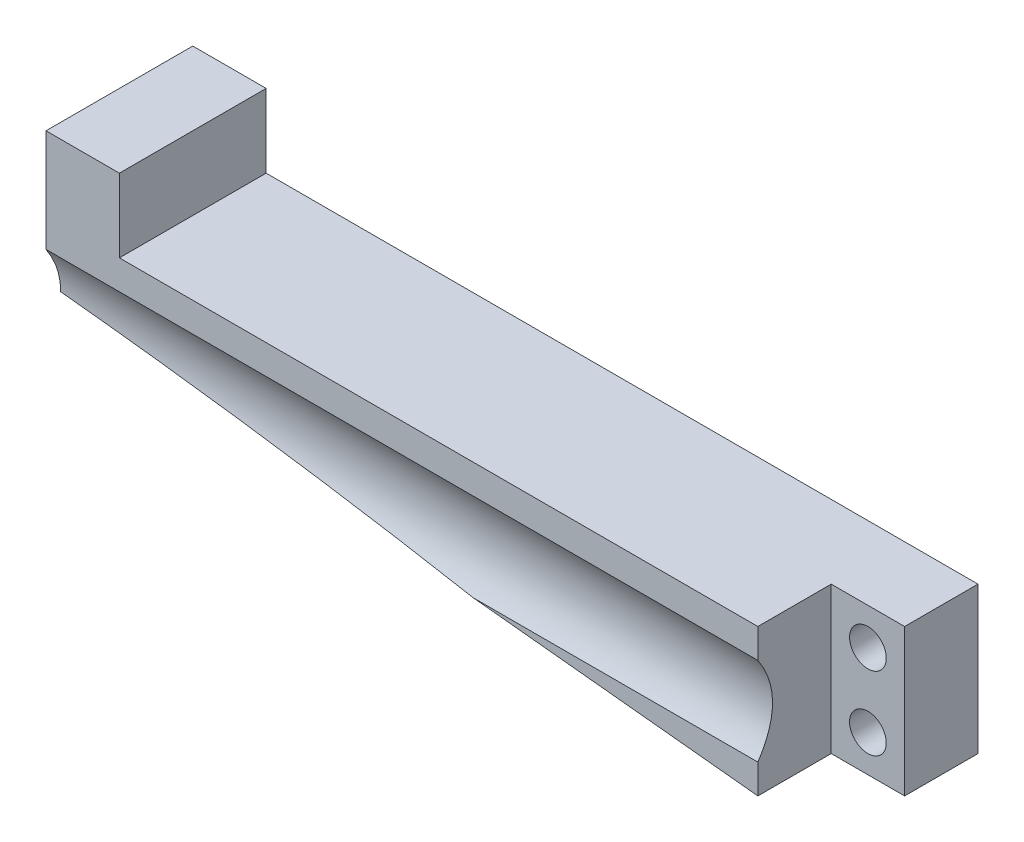
ISO-10303-21;
HEADER;
FILE_DESCRIPTION(('STEP AP214'),'2;1');
FILE_NAME('part.step','',(''),(''),'','','');
FILE_SCHEMA(('AUTOMOTIVE_DESIGN { 1 0 10303 214 1 1 1 1 }'));
ENDSEC;
DATA;
#1=APPLICATION_CONTEXT('core data for automotive mechanical design processes');
#2=APPLICATION_PROTOCOL_DEFINITION('international standard','automotive_design',2000,#1);
#3=PRODUCT_CONTEXT('',#1,'mechanical');
#4=PRODUCT('Part','Part','',(#3));
#5=PRODUCT_RELATED_PRODUCT_CATEGORY('part','',(#4));
#6=PRODUCT_DEFINITION_FORMATION('','',#4);
#7=PRODUCT_DEFINITION_CONTEXT('part definition',#1,'design');
#8=PRODUCT_DEFINITION('design','',#6,#7);
#9=PRODUCT_DEFINITION_SHAPE('','',#8);
#10=(LENGTH_UNIT() NAMED_UNIT(*) SI_UNIT(.MILLI.,.METRE.));
#11=(NAMED_UNIT(*) PLANE_ANGLE_UNIT() SI_UNIT($,.RADIAN.));
#12=(NAMED_UNIT(*) SI_UNIT($,.STERADIAN.) SOLID_ANGLE_UNIT());
#13=UNCERTAINTY_MEASURE_WITH_UNIT(LENGTH_MEASURE(1.E-05),#10,'distance_accuracy_value','');
#14=(GEOMETRIC_REPRESENTATION_CONTEXT(3) GLOBAL_UNCERTAINTY_ASSIGNED_CONTEXT((#13)) GLOBAL_UNIT_ASSIGNED_CONTEXT((#10,
#11,#12)) REPRESENTATION_CONTEXT('',''));
#15=CARTESIAN_POINT('',(0.,0.,0.));
#16=DIRECTION('',(0.,0.,1.));
#17=DIRECTION('',(1.,0.,0.));
#18=AXIS2_PLACEMENT_3D('',#15,#16,#17);
#19=CARTESIAN_POINT('',(0.,0.,20.));
#20=DIRECTION('',(0.,0.,-1.));
#21=DIRECTION('',(-1.,0.,0.));
#22=AXIS2_PLACEMENT_3D('',#19,#20,#21);
#23=PLANE('',#22);
#24=DIRECTION('',(0.,-1.,0.));
#25=VECTOR('',#24,1.);
#26=CARTESIAN_POINT('',(-102.,9.99999999999999,20.));
#27=LINE('',#26,#25);
#28=CARTESIAN_POINT('',(-102.,20.,20.));
#29=VERTEX_POINT('',#28);
#30=CARTESIAN_POINT('',(-102.,5.99999999999998,20.));
#31=VERTEX_POINT('',#30);
#32=EDGE_CURVE('E127',#29,#31,#27,.T.);
#33=ORIENTED_EDGE('',*,*,#32,.T.);
#34=DIRECTION('',(-1.,0.,0.));
#35=VECTOR('',#34,1.);
#36=CARTESIAN_POINT('',(7.16552506059642,5.99999999999998,20.));
#37=LINE('',#36,#35);
#38=CARTESIAN_POINT('',(-5.,5.99999999999998,20.));
#39=VERTEX_POINT('',#38);
#40=EDGE_CURVE('E111',#39,#31,#37,.T.);
#41=ORIENTED_EDGE('',*,*,#40,.F.);
#42=DIRECTION('',(0.,-1.,0.));
#43=VECTOR('',#42,1.);
#44=CARTESIAN_POINT('',(-5.,-10.,20.));
#45=LINE('',#44,#43);
#46=CARTESIAN_POINT('',(-5.,10.,20.));
#47=VERTEX_POINT('',#46);
#48=EDGE_CURVE('E200',#47,#39,#45,.T.);
#49=ORIENTED_EDGE('',*,*,#48,.F.);
#50=DIRECTION('',(-1.,0.,0.));
#51=VECTOR('',#50,1.);
#52=CARTESIAN_POINT('',(-5.,10.,20.));
#53=LINE('',#52,#51);
#54=CARTESIAN_POINT('',(-92.,9.99999999999999,20.));
#55=VERTEX_POINT('',#54);
#56=EDGE_CURVE('E161',#47,#55,#53,.T.);
#57=ORIENTED_EDGE('',*,*,#56,.T.);
#58=DIRECTION('',(0.,1.,0.));
#59=VECTOR('',#58,1.);
#60=CARTESIAN_POINT('',(-92.,9.99999999999999,20.));
#61=LINE('',#60,#59);
#62=CARTESIAN_POINT('',(-92.,20.,20.));
#63=VERTEX_POINT('',#62);
#64=EDGE_CURVE('E138',#55,#63,#61,.T.);
#65=ORIENTED_EDGE('',*,*,#64,.T.);
#66=DIRECTION('',(-1.,0.,0.));
#67=VECTOR('',#66,1.);
#68=CARTESIAN_POINT('',(-102.,20.,20.));
#69=LINE('',#68,#67);
#70=EDGE_CURVE('E132',#63,#29,#69,.T.);
#71=ORIENTED_EDGE('',*,*,#70,.T.);
#72=EDGE_LOOP('',(#33,#41,#49,#57,#65,#71));
#73=FACE_BOUND('',#72,.T.);
#74=ADVANCED_FACE('F33',(#73),#23,.F.);
#75=CARTESIAN_POINT('',(-5.,-6.00000000000002,20.));
#76=VERTEX_POINT('',#75);
#77=CARTESIAN_POINT('',(-5.,-10.,20.));
#78=VERTEX_POINT('',#77);
#79=EDGE_CURVE('E197',#76,#78,#45,.T.);
#80=ORIENTED_EDGE('',*,*,#79,.F.);
#81=DIRECTION('',(-1.,0.,0.));
#82=VECTOR('',#81,1.);
#83=CARTESIAN_POINT('',(7.16552506059642,-6.00000000000002,20.));
#84=LINE('',#83,#82);
#85=CARTESIAN_POINT('',(-43.7999999999993,-6.00000000000005,20.));
#86=VERTEX_POINT('',#85);
#87=EDGE_CURVE('E49',#76,#86,#84,.T.);
#88=ORIENTED_EDGE('',*,*,#87,.T.);
#89=DIRECTION('',(0.99472792615428,-0.102549270737555,0.));
#90=VECTOR('',#89,1.);
#91=CARTESIAN_POINT('',(-102.,0.,20.));
#92=LINE('',#91,#90);
#93=EDGE_CURVE('E134',#86,#78,#92,.T.);
#94=ORIENTED_EDGE('',*,*,#93,.T.);
#95=EDGE_LOOP('',(#80,#88,#94));
#96=FACE_BOUND('',#95,.T.);
#97=ADVANCED_FACE('F251',(#96),#23,.F.);
#98=CARTESIAN_POINT('',(0.,0.,0.));
#99=DIRECTION('',(0.,0.,-1.));
#100=DIRECTION('',(-1.,0.,0.));
#101=AXIS2_PLACEMENT_3D('',#98,#99,#100);
#102=PLANE('',#101);
#103=CARTESIAN_POINT('',(0.,5.,0.));
#104=DIRECTION('',(0.,0.,1.));
#105=DIRECTION('',(1.,0.,0.));
#106=AXIS2_PLACEMENT_3D('',#103,#104,#105);
#107=CIRCLE('',#106,2.5);
#108=CARTESIAN_POINT('',(2.5,5.,0.));
#109=VERTEX_POINT('',#108);
#110=EDGE_CURVE('E146',#109,#109,#107,.T.);
#111=ORIENTED_EDGE('',*,*,#110,.T.);
#112=EDGE_LOOP('',(#111));
#113=FACE_BOUND('',#112,.T.);
#114=DIRECTION('',(0.,1.,0.));
#115=VECTOR('',#114,1.);
#116=CARTESIAN_POINT('',(5.,-10.,0.));
#117=LINE('',#116,#115);
#118=CARTESIAN_POINT('',(5.,-10.,0.));
#119=VERTEX_POINT('',#118);
#120=CARTESIAN_POINT('',(5.,10.,0.));
#121=VERTEX_POINT('',#120);
#122=EDGE_CURVE('E142',#119,#121,#117,.T.);
#123=ORIENTED_EDGE('',*,*,#122,.F.);
#124=DIRECTION('',(1.,0.,0.));
#125=VECTOR('',#124,1.);
#126=CARTESIAN_POINT('',(-5.,-10.,0.));
#127=LINE('',#126,#125);
#128=CARTESIAN_POINT('',(-5.,-10.,0.));
#129=VERTEX_POINT('',#128);
#130=EDGE_CURVE('E158',#129,#119,#127,.T.);
#131=ORIENTED_EDGE('',*,*,#130,.F.);
#132=DIRECTION('',(0.99472792615428,-0.102549270737555,0.));
#133=VECTOR('',#132,1.);
#134=CARTESIAN_POINT('',(-102.,0.,0.));
#135=LINE('',#134,#133);
#136=CARTESIAN_POINT('',(-102.,0.,0.));
#137=VERTEX_POINT('',#136);
#138=EDGE_CURVE('E155',#137,#129,#135,.T.);
#139=ORIENTED_EDGE('',*,*,#138,.F.);
#140=DIRECTION('',(0.,-1.,0.));
#141=VECTOR('',#140,1.);
#142=CARTESIAN_POINT('',(-102.,9.99999999999999,0.));
#143=LINE('',#142,#141);
#144=CARTESIAN_POINT('',(-102.,20.,0.));
#145=VERTEX_POINT('',#144);
#146=EDGE_CURVE('E153',#145,#137,#143,.T.);
#147=ORIENTED_EDGE('',*,*,#146,.F.);
#148=DIRECTION('',(-1.,0.,0.));
#149=VECTOR('',#148,1.);
#150=CARTESIAN_POINT('',(-102.,20.,0.));
#151=LINE('',#150,#149);
#152=CARTESIAN_POINT('',(-92.,20.,0.));
#153=VERTEX_POINT('',#152);
#154=EDGE_CURVE('E150',#153,#145,#151,.T.);
#155=ORIENTED_EDGE('',*,*,#154,.F.);
#156=DIRECTION('',(0.,1.,0.));
#157=VECTOR('',#156,1.);
#158=CARTESIAN_POINT('',(-92.,9.99999999999999,0.));
#159=LINE('',#158,#157);
#160=CARTESIAN_POINT('',(-92.,9.99999999999999,0.));
#161=VERTEX_POINT('',#160);
#162=EDGE_CURVE('E148',#161,#153,#159,.T.);
#163=ORIENTED_EDGE('',*,*,#162,.F.);
#164=DIRECTION('',(-1.,0.,0.));
#165=VECTOR('',#164,1.);
#166=CARTESIAN_POINT('',(-5.,10.,0.));
#167=LINE('',#166,#165);
#168=EDGE_CURVE('E145',#121,#161,#167,.T.);
#169=ORIENTED_EDGE('',*,*,#168,.F.);
#170=EDGE_LOOP('',(#123,#131,#139,#147,#155,#163,#169));
#171=FACE_BOUND('',#170,.T.);
#172=CARTESIAN_POINT('',(0.,-5.,0.));
#173=DIRECTION('',(0.,0.,1.));
#174=DIRECTION('',(1.,0.,0.));
#175=AXIS2_PLACEMENT_3D('',#172,#173,#174);
#176=CIRCLE('',#175,2.5);
#177=CARTESIAN_POINT('',(2.5,-5.,0.));
#178=VERTEX_POINT('',#177);
#179=EDGE_CURVE('E374',#178,#178,#176,.T.);
#180=ORIENTED_EDGE('',*,*,#179,.T.);
#181=EDGE_LOOP('',(#180));
#182=FACE_BOUND('',#181,.T.);
#183=ADVANCED_FACE('F185',(#113,#171,#182),#102,.T.);
#184=CARTESIAN_POINT('',(5.,-10.,20.));
#185=DIRECTION('',(-1.,0.,0.));
#186=DIRECTION('',(0.,0.,1.));
#187=AXIS2_PLACEMENT_3D('',#184,#185,#186);
#188=PLANE('',#187);
#189=DIRECTION('',(0.,0.,-1.));
#190=VECTOR('',#189,1.);
#191=CARTESIAN_POINT('',(5.,10.,20.));
#192=LINE('',#191,#190);
#193=CARTESIAN_POINT('',(5.,10.,10.));
#194=VERTEX_POINT('',#193);
#195=EDGE_CURVE('E11',#194,#121,#192,.T.);
#196=ORIENTED_EDGE('',*,*,#195,.F.);
#197=DIRECTION('',(0.,1.,0.));
#198=VECTOR('',#197,1.);
#199=CARTESIAN_POINT('',(5.,-10.,10.));
#200=LINE('',#199,#198);
#201=CARTESIAN_POINT('',(5.,-10.,10.));
#202=VERTEX_POINT('',#201);
#203=EDGE_CURVE('E383',#202,#194,#200,.T.);
#204=ORIENTED_EDGE('',*,*,#203,.F.);
#205=DIRECTION('',(0.,0.,-1.));
#206=VECTOR('',#205,1.);
#207=CARTESIAN_POINT('',(5.,-10.,20.));
#208=LINE('',#207,#206);
#209=EDGE_CURVE('E136',#202,#119,#208,.T.);
#210=ORIENTED_EDGE('',*,*,#209,.T.);
#211=ORIENTED_EDGE('',*,*,#122,.T.);
#212=EDGE_LOOP('',(#196,#204,#210,#211));
#213=FACE_BOUND('',#212,.T.);
#214=ADVANCED_FACE('F35',(#213),#188,.F.);
#215=CARTESIAN_POINT('',(-5.,10.,20.));
#216=DIRECTION('',(0.,-1.,0.));
#217=DIRECTION('',(1.,0.,0.));
#218=AXIS2_PLACEMENT_3D('',#215,#216,#217);
#219=PLANE('',#218);
#220=ORIENTED_EDGE('',*,*,#56,.F.);
#221=DIRECTION('',(0.,0.,1.));
#222=VECTOR('',#221,1.);
#223=CARTESIAN_POINT('',(-5.,10.,10.));
#224=LINE('',#223,#222);
#225=CARTESIAN_POINT('',(-5.,10.,10.));
#226=VERTEX_POINT('',#225);
#227=EDGE_CURVE('E369',#226,#47,#224,.T.);
#228=ORIENTED_EDGE('',*,*,#227,.F.);
#229=DIRECTION('',(-1.,0.,0.));
#230=VECTOR('',#229,1.);
#231=CARTESIAN_POINT('',(-5.,10.,10.));
#232=LINE('',#231,#230);
#233=EDGE_CURVE('E380',#194,#226,#232,.T.);
#234=ORIENTED_EDGE('',*,*,#233,.F.);
#235=ORIENTED_EDGE('',*,*,#195,.T.);
#236=ORIENTED_EDGE('',*,*,#168,.T.);
#237=DIRECTION('',(0.,0.,-1.));
#238=VECTOR('',#237,1.);
#239=CARTESIAN_POINT('',(-92.,9.99999999999999,20.));
#240=LINE('',#239,#238);
#241=EDGE_CURVE('E42',#55,#161,#240,.T.);
#242=ORIENTED_EDGE('',*,*,#241,.F.);
#243=EDGE_LOOP('',(#220,#228,#234,#235,#236,#242));
#244=FACE_BOUND('',#243,.T.);
#245=ADVANCED_FACE('F283',(#244),#219,.F.);
#246=CARTESIAN_POINT('',(-92.,9.99999999999999,20.));
#247=DIRECTION('',(-1.,0.,0.));
#248=DIRECTION('',(0.,0.,1.));
#249=AXIS2_PLACEMENT_3D('',#246,#247,#248);
#250=PLANE('',#249);
#251=ORIENTED_EDGE('',*,*,#162,.T.);
#252=DIRECTION('',(0.,0.,-1.));
#253=VECTOR('',#252,1.);
#254=CARTESIAN_POINT('',(-92.,20.,20.));
#255=LINE('',#254,#253);
#256=EDGE_CURVE('E169',#63,#153,#255,.T.);
#257=ORIENTED_EDGE('',*,*,#256,.F.);
#258=ORIENTED_EDGE('',*,*,#64,.F.);
#259=ORIENTED_EDGE('',*,*,#241,.T.);
#260=EDGE_LOOP('',(#251,#257,#258,#259));
#261=FACE_BOUND('',#260,.T.);
#262=ADVANCED_FACE('F177',(#261),#250,.F.);
#263=CARTESIAN_POINT('',(-102.,20.,20.));
#264=DIRECTION('',(0.,-1.,0.));
#265=DIRECTION('',(0.,0.,-1.));
#266=AXIS2_PLACEMENT_3D('',#263,#264,#265);
#267=PLANE('',#266);
#268=ORIENTED_EDGE('',*,*,#154,.T.);
#269=DIRECTION('',(0.,0.,-1.));
#270=VECTOR('',#269,1.);
#271=CARTESIAN_POINT('',(-102.,20.,20.));
#272=LINE('',#271,#270);
#273=EDGE_CURVE('E167',#29,#145,#272,.T.);
#274=ORIENTED_EDGE('',*,*,#273,.F.);
#275=ORIENTED_EDGE('',*,*,#70,.F.);
#276=ORIENTED_EDGE('',*,*,#256,.T.);
#277=EDGE_LOOP('',(#268,#274,#275,#276));
#278=FACE_BOUND('',#277,.T.);
#279=ADVANCED_FACE('F189',(#278),#267,.F.);
#280=CARTESIAN_POINT('',(-102.,9.99999999999999,20.));
#281=DIRECTION('',(1.,0.,0.));
#282=DIRECTION('',(0.,0.,-1.));
#283=AXIS2_PLACEMENT_3D('',#280,#281,#282);
#284=PLANE('',#283);
#285=DIRECTION('',(0.,0.,-1.));
#286=VECTOR('',#285,1.);
#287=CARTESIAN_POINT('',(-102.,0.,20.));
#288=LINE('',#287,#286);
#289=CARTESIAN_POINT('',(-102.,0.,18.));
#290=VERTEX_POINT('',#289);
#291=EDGE_CURVE('E129',#290,#137,#288,.T.);
#292=ORIENTED_EDGE('',*,*,#291,.F.);
#293=CARTESIAN_POINT('',(-102.,5.99999999999998,20.));
#294=CARTESIAN_POINT('',(-102.,0.,16.));
#295=CARTESIAN_POINT('',(-102.,-6.00000000000002,20.));
#296=B_SPLINE_CURVE_WITH_KNOTS('',2,(#293,#294,#295),.UNSPECIFIED.,.F.,.F.,(3,3),(0.,1.),.UNSPECIFIED.);
#297=EDGE_CURVE('E114',#31,#290,#296,.T.);
#298=ORIENTED_EDGE('',*,*,#297,.F.);
#299=ORIENTED_EDGE('',*,*,#32,.F.);
#300=ORIENTED_EDGE('',*,*,#273,.T.);
#301=ORIENTED_EDGE('',*,*,#146,.T.);
#302=EDGE_LOOP('',(#292,#298,#299,#300,#301));
#303=FACE_BOUND('',#302,.T.);
#304=ADVANCED_FACE('F125',(#303),#284,.F.);
#305=CARTESIAN_POINT('',(-102.,0.,20.));
#306=DIRECTION('',(0.102549270737555,0.994727926154281,0.));
#307=DIRECTION('',(-0.994727926154281,0.102549270737555,0.));
#308=AXIS2_PLACEMENT_3D('',#305,#306,#307);
#309=PLANE('',#308);
#310=ORIENTED_EDGE('',*,*,#93,.F.);
#311=CARTESIAN_POINT('',(-43.7999999999999,-6.00000000000002,20.));
#312=CARTESIAN_POINT('',(-46.777742819639,-5.69301620416093,19.7953437538133));
#313=CARTESIAN_POINT('',(-49.7565113950411,-5.38592666030505,19.6063249567808));
#314=CARTESIAN_POINT('',(-55.715319727908,-4.77161652289609,19.2596662517836));
#315=CARTESIAN_POINT('',(-58.6953591624944,-4.46439596262945,19.1020207344725));
#316=CARTESIAN_POINT('',(-68.3903748084975,-3.46490981355697,18.640363011876));
#317=CARTESIAN_POINT('',(-75.1085219038092,-2.77231732950422,18.4003260541048));
#318=CARTESIAN_POINT('',(-85.189727452418,-1.73301778841053,18.1601799983965));
#319=CARTESIAN_POINT('',(-88.5515083895155,-1.38644243407058,18.1001161976398));
#320=CARTESIAN_POINT('',(-95.2755110496862,-0.693246283537521,18.0200256124184));
#321=CARTESIAN_POINT('',(-98.637732768402,-0.346625487793626,17.9999984582198));
#322=CARTESIAN_POINT('',(-102.,0.,18.));
#323=B_SPLINE_CURVE_WITH_KNOTS('',3,(#311,#312,#313,#314,#315,#316,#317,#318,#319,#320,#321,
#322),.UNSPECIFIED.,.F.,.F.,(4,2,2,2,2,4),(0.,9.00142076857571,18.0012306905934,
38.2730176822201,48.4132224925829,58.5533336589014),.UNSPECIFIED.);
#324=EDGE_CURVE('E196',#86,#290,#323,.T.);
#325=ORIENTED_EDGE('',*,*,#324,.T.);
#326=ORIENTED_EDGE('',*,*,#291,.T.);
#327=ORIENTED_EDGE('',*,*,#138,.T.);
#328=DIRECTION('',(0.,0.,-1.));
#329=VECTOR('',#328,1.);
#330=CARTESIAN_POINT('',(-5.,-10.,20.));
#331=LINE('',#330,#329);
#332=CARTESIAN_POINT('',(-5.,-10.,10.));
#333=VERTEX_POINT('',#332);
#334=EDGE_CURVE('E163',#333,#129,#331,.T.);
#335=ORIENTED_EDGE('',*,*,#334,.F.);
#336=EDGE_CURVE('E164',#78,#333,#331,.T.);
#337=ORIENTED_EDGE('',*,*,#336,.F.);
#338=EDGE_LOOP('',(#310,#325,#326,#327,#335,#337));
#339=FACE_BOUND('',#338,.T.);
#340=ADVANCED_FACE('F194',(#339),#309,.F.);
#341=CARTESIAN_POINT('',(-5.,-10.,20.));
#342=DIRECTION('',(0.,1.,0.));
#343=DIRECTION('',(0.,0.,1.));
#344=AXIS2_PLACEMENT_3D('',#341,#342,#343);
#345=PLANE('',#344);
#346=ORIENTED_EDGE('',*,*,#209,.F.);
#347=DIRECTION('',(1.,0.,0.));
#348=VECTOR('',#347,1.);
#349=CARTESIAN_POINT('',(-5.,-10.,10.));
#350=LINE('',#349,#348);
#351=EDGE_CURVE('E384',#333,#202,#350,.T.);
#352=ORIENTED_EDGE('',*,*,#351,.F.);
#353=ORIENTED_EDGE('',*,*,#334,.T.);
#354=ORIENTED_EDGE('',*,*,#130,.T.);
#355=EDGE_LOOP('',(#346,#352,#353,#354));
#356=FACE_BOUND('',#355,.T.);
#357=ADVANCED_FACE('F249',(#356),#345,.F.);
#358=CARTESIAN_POINT('',(0.,5.,20.));
#359=DIRECTION('',(0.,0.,-1.));
#360=DIRECTION('',(-1.,0.,0.));
#361=AXIS2_PLACEMENT_3D('',#358,#359,#360);
#362=CYLINDRICAL_SURFACE('',#361,2.5);
#363=CARTESIAN_POINT('',(0.,5.,10.));
#364=DIRECTION('',(0.,0.,-1.));
#365=DIRECTION('',(-1.,0.,0.));
#366=AXIS2_PLACEMENT_3D('',#363,#364,#365);
#367=CIRCLE('',#366,2.5);
#368=CARTESIAN_POINT('',(-2.5,5.,10.));
#369=VERTEX_POINT('',#368);
#370=EDGE_CURVE('E377',#369,#369,#367,.T.);
#371=ORIENTED_EDGE('',*,*,#370,.F.);
#372=EDGE_LOOP('',(#371));
#373=FACE_BOUND('',#372,.T.);
#374=ORIENTED_EDGE('',*,*,#110,.F.);
#375=EDGE_LOOP('',(#374));
#376=FACE_BOUND('',#375,.T.);
#377=ADVANCED_FACE('F245',(#373,#376),#362,.F.);
#378=CARTESIAN_POINT('',(0.,-5.,20.));
#379=DIRECTION('',(0.,0.,-1.));
#380=DIRECTION('',(-1.,0.,0.));
#381=AXIS2_PLACEMENT_3D('',#378,#379,#380);
#382=CYLINDRICAL_SURFACE('',#381,2.5);
#383=CARTESIAN_POINT('',(0.,-5.,10.));
#384=DIRECTION('',(0.,0.,-1.));
#385=DIRECTION('',(-1.,0.,0.));
#386=AXIS2_PLACEMENT_3D('',#383,#384,#385);
#387=CIRCLE('',#386,2.5);
#388=CARTESIAN_POINT('',(-2.5,-5.,10.));
#389=VERTEX_POINT('',#388);
#390=EDGE_CURVE('E37',#389,#389,#387,.T.);
#391=ORIENTED_EDGE('',*,*,#390,.F.);
#392=EDGE_LOOP('',(#391));
#393=FACE_BOUND('',#392,.T.);
#394=ORIENTED_EDGE('',*,*,#179,.F.);
#395=EDGE_LOOP('',(#394));
#396=FACE_BOUND('',#395,.T.);
#397=ADVANCED_FACE('F241',(#393,#396),#382,.F.);
#398=CARTESIAN_POINT('',(-5.,-10.,10.));
#399=DIRECTION('',(-1.,0.,0.));
#400=DIRECTION('',(0.,0.,1.));
#401=AXIS2_PLACEMENT_3D('',#398,#399,#400);
#402=PLANE('',#401);
#403=ORIENTED_EDGE('',*,*,#48,.T.);
#404=CARTESIAN_POINT('',(-5.,5.99999999999998,20.));
#405=CARTESIAN_POINT('',(-5.,0.,16.));
#406=CARTESIAN_POINT('',(-5.,-6.00000000000002,20.));
#407=B_SPLINE_CURVE_WITH_KNOTS('',2,(#404,#405,#406),.UNSPECIFIED.,.F.,.F.,(3,3),(0.,1.),.UNSPECIFIED.);
#408=EDGE_CURVE('E116',#76,#39,#407,.F.);
#409=ORIENTED_EDGE('',*,*,#408,.F.);
#410=ORIENTED_EDGE('',*,*,#79,.T.);
#411=ORIENTED_EDGE('',*,*,#336,.T.);
#412=DIRECTION('',(0.,-1.,0.));
#413=VECTOR('',#412,1.);
#414=CARTESIAN_POINT('',(-5.,-10.,10.));
#415=LINE('',#414,#413);
#416=EDGE_CURVE('E57',#226,#333,#415,.T.);
#417=ORIENTED_EDGE('',*,*,#416,.F.);
#418=ORIENTED_EDGE('',*,*,#227,.T.);
#419=EDGE_LOOP('',(#403,#409,#410,#411,#417,#418));
#420=FACE_BOUND('',#419,.T.);
#421=ADVANCED_FACE('F237',(#420),#402,.F.);
#422=CARTESIAN_POINT('',(0.,0.,10.));
#423=DIRECTION('',(0.,0.,-1.));
#424=DIRECTION('',(-1.,0.,0.));
#425=AXIS2_PLACEMENT_3D('',#422,#423,#424);
#426=PLANE('',#425);
#427=ORIENTED_EDGE('',*,*,#370,.T.);
#428=EDGE_LOOP('',(#427));
#429=FACE_BOUND('',#428,.T.);
#430=ORIENTED_EDGE('',*,*,#390,.T.);
#431=EDGE_LOOP('',(#430));
#432=FACE_BOUND('',#431,.T.);
#433=ORIENTED_EDGE('',*,*,#416,.T.);
#434=ORIENTED_EDGE('',*,*,#351,.T.);
#435=ORIENTED_EDGE('',*,*,#203,.T.);
#436=ORIENTED_EDGE('',*,*,#233,.T.);
#437=EDGE_LOOP('',(#433,#434,#435,#436));
#438=FACE_BOUND('',#437,.T.);
#439=ADVANCED_FACE('F218',(#429,#432,#438),#426,.F.);
#440=CARTESIAN_POINT('',(7.16552506059642,5.99999999999998,20.));
#441=CARTESIAN_POINT('',(7.16552506059642,0.,16.));
#442=CARTESIAN_POINT('',(7.16552506059642,-6.00000000000002,20.));
#443=B_SPLINE_CURVE_WITH_KNOTS('',2,(#440,#441,#442),.UNSPECIFIED.,.F.,.F.,(3,3),(0.,1.),.UNSPECIFIED.);
#444=DIRECTION('',(-1.,0.,0.));
#445=VECTOR('',#444,1.);
#446=SURFACE_OF_LINEAR_EXTRUSION('',#443,#445);
#447=ORIENTED_EDGE('',*,*,#87,.F.);
#448=ORIENTED_EDGE('',*,*,#408,.T.);
#449=ORIENTED_EDGE('',*,*,#40,.T.);
#450=ORIENTED_EDGE('',*,*,#297,.T.);
#451=ORIENTED_EDGE('',*,*,#324,.F.);
#452=EDGE_LOOP('',(#447,#448,#449,#450,#451));
#453=FACE_BOUND('',#452,.T.);
#454=ADVANCED_FACE('F113',(#453),#446,.F.);
#455=CLOSED_SHELL('',(#74,#97,#183,#214,#245,#262,#279,#304,#340,#357,#377,#397,#421,#439,#454));
#456=MANIFOLD_SOLID_BREP('B2',#455);
#457=ADVANCED_BREP_SHAPE_REPRESENTATION('',(#18,#456),#14);
#458=SHAPE_DEFINITION_REPRESENTATION(#9,#457);
ENDSEC;
END-ISO-10303-21;
